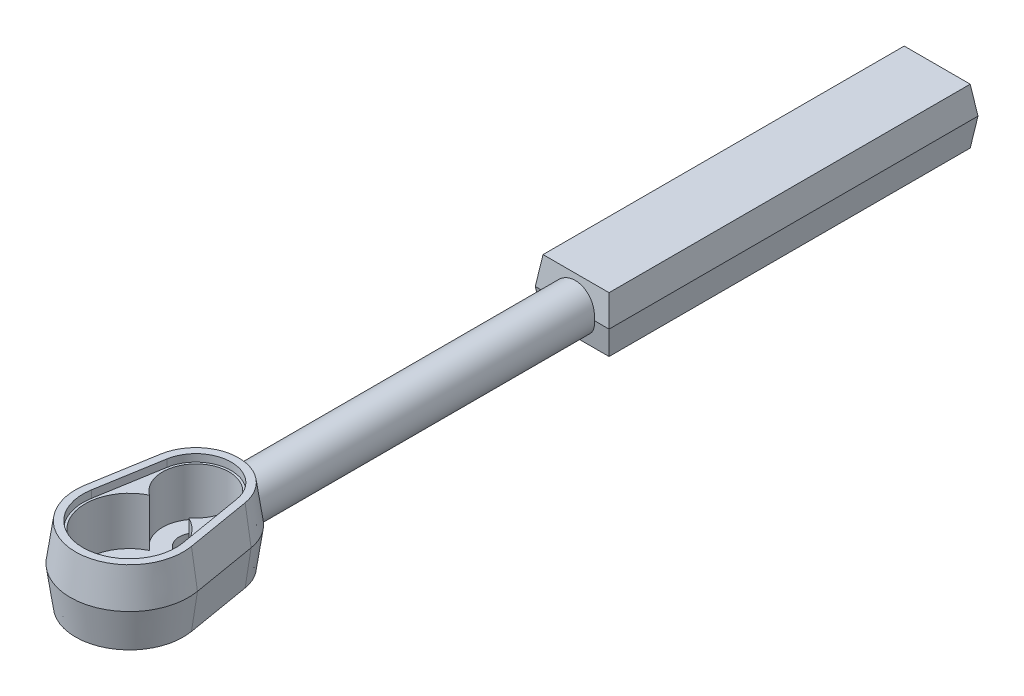
ISO-10303-21;
HEADER;
FILE_DESCRIPTION(('STEP AP214'),'2;1');
FILE_NAME('part.step','',(''),(''),'','','');
FILE_SCHEMA(('AUTOMOTIVE_DESIGN { 1 0 10303 214 1 1 1 1 }'));
ENDSEC;
DATA;
#1=APPLICATION_CONTEXT('core data for automotive mechanical design processes');
#2=APPLICATION_PROTOCOL_DEFINITION('international standard','automotive_design',2000,#1);
#3=PRODUCT_CONTEXT('',#1,'mechanical');
#4=PRODUCT('Part','Part','',(#3));
#5=PRODUCT_RELATED_PRODUCT_CATEGORY('part','',(#4));
#6=PRODUCT_DEFINITION_FORMATION('','',#4);
#7=PRODUCT_DEFINITION_CONTEXT('part definition',#1,'design');
#8=PRODUCT_DEFINITION('design','',#6,#7);
#9=PRODUCT_DEFINITION_SHAPE('','',#8);
#10=(LENGTH_UNIT() NAMED_UNIT(*) SI_UNIT(.MILLI.,.METRE.));
#11=(NAMED_UNIT(*) PLANE_ANGLE_UNIT() SI_UNIT($,.RADIAN.));
#12=(NAMED_UNIT(*) SI_UNIT($,.STERADIAN.) SOLID_ANGLE_UNIT());
#13=UNCERTAINTY_MEASURE_WITH_UNIT(LENGTH_MEASURE(1.E-05),#10,'distance_accuracy_value','');
#14=(GEOMETRIC_REPRESENTATION_CONTEXT(3) GLOBAL_UNCERTAINTY_ASSIGNED_CONTEXT((#13)) GLOBAL_UNIT_ASSIGNED_CONTEXT((#10,
#11,#12)) REPRESENTATION_CONTEXT('',''));
#15=CARTESIAN_POINT('',(0.,0.,0.));
#16=DIRECTION('',(0.,0.,1.));
#17=DIRECTION('',(1.,0.,0.));
#18=AXIS2_PLACEMENT_3D('',#15,#16,#17);
#19=CARTESIAN_POINT('',(-10.,0.,-220.));
#20=DIRECTION('',(-0.99026806874157,-0.139173100960066,0.));
#21=DIRECTION('',(0.139173100960066,-0.99026806874157,0.));
#22=AXIS2_PLACEMENT_3D('',#19,#20,#21);
#23=PLANE('',#22);
#24=DIRECTION('',(0.,0.,1.));
#25=VECTOR('',#24,1.);
#26=CARTESIAN_POINT('',(-10.,0.,-220.));
#27=LINE('',#26,#25);
#28=CARTESIAN_POINT('',(-10.,0.,-220.));
#29=VERTEX_POINT('',#28);
#30=CARTESIAN_POINT('',(-10.,0.,-120.));
#31=VERTEX_POINT('',#30);
#32=EDGE_CURVE('E339',#29,#31,#27,.T.);
#33=ORIENTED_EDGE('',*,*,#32,.F.);
#34=DIRECTION('',(-0.137844537491629,0.980814848463989,-0.137844537491629));
#35=VECTOR('',#34,1.);
#36=CARTESIAN_POINT('',(-10.,0.,-220.));
#37=LINE('',#36,#35);
#38=CARTESIAN_POINT('',(-8.94594373973206,-7.5,-218.945943739732));
#39=VERTEX_POINT('',#38);
#40=EDGE_CURVE('E381',#39,#29,#37,.T.);
#41=ORIENTED_EDGE('',*,*,#40,.F.);
#42=DIRECTION('',(0.,0.,1.));
#43=VECTOR('',#42,1.);
#44=CARTESIAN_POINT('',(-8.94594373973206,-7.5,-220.));
#45=LINE('',#44,#43);
#46=CARTESIAN_POINT('',(-8.94594373973208,-7.5,-121.054056260268));
#47=VERTEX_POINT('',#46);
#48=EDGE_CURVE('E380',#39,#47,#45,.T.);
#49=ORIENTED_EDGE('',*,*,#48,.T.);
#50=DIRECTION('',(-0.137844537491629,0.980814848463989,0.137844537491629));
#51=VECTOR('',#50,1.);
#52=CARTESIAN_POINT('',(-8.09988834837191,-13.5199969151441,-121.900111651628));
#53=LINE('',#52,#51);
#54=EDGE_CURVE('E386',#47,#31,#53,.T.);
#55=ORIENTED_EDGE('',*,*,#54,.T.);
#56=EDGE_LOOP('',(#33,#41,#49,#55));
#57=FACE_BOUND('',#56,.T.);
#58=ADVANCED_FACE('F41',(#57),#23,.T.);
#59=CARTESIAN_POINT('',(-10.,0.,-220.));
#60=DIRECTION('',(0.,-0.139173100960066,-0.99026806874157));
#61=DIRECTION('',(0.,0.99026806874157,-0.139173100960066));
#62=AXIS2_PLACEMENT_3D('',#59,#60,#61);
#63=PLANE('',#62);
#64=DIRECTION('',(-1.,0.,0.));
#65=VECTOR('',#64,1.);
#66=CARTESIAN_POINT('',(-10.,0.,-220.));
#67=LINE('',#66,#65);
#68=CARTESIAN_POINT('',(10.,0.,-220.));
#69=VERTEX_POINT('',#68);
#70=EDGE_CURVE('E376',#69,#29,#67,.T.);
#71=ORIENTED_EDGE('',*,*,#70,.F.);
#72=DIRECTION('',(0.137844537491629,0.980814848463989,-0.137844537491629));
#73=VECTOR('',#72,1.);
#74=CARTESIAN_POINT('',(10.,0.,-220.));
#75=LINE('',#74,#73);
#76=CARTESIAN_POINT('',(8.94594373973206,-7.5,-218.945943739732));
#77=VERTEX_POINT('',#76);
#78=EDGE_CURVE('E385',#77,#69,#75,.T.);
#79=ORIENTED_EDGE('',*,*,#78,.F.);
#80=DIRECTION('',(-1.,0.,0.));
#81=VECTOR('',#80,1.);
#82=CARTESIAN_POINT('',(-10.,-7.5,-218.945943739732));
#83=LINE('',#82,#81);
#84=EDGE_CURVE('E390',#77,#39,#83,.T.);
#85=ORIENTED_EDGE('',*,*,#84,.T.);
#86=ORIENTED_EDGE('',*,*,#40,.T.);
#87=EDGE_LOOP('',(#71,#79,#85,#86));
#88=FACE_BOUND('',#87,.T.);
#89=ADVANCED_FACE('F43',(#88),#63,.T.);
#90=CARTESIAN_POINT('',(10.,0.,-220.));
#91=DIRECTION('',(0.99026806874157,-0.139173100960066,0.));
#92=DIRECTION('',(0.139173100960066,0.99026806874157,0.));
#93=AXIS2_PLACEMENT_3D('',#90,#91,#92);
#94=PLANE('',#93);
#95=DIRECTION('',(0.,0.,-1.));
#96=VECTOR('',#95,1.);
#97=CARTESIAN_POINT('',(10.,0.,-220.));
#98=LINE('',#97,#96);
#99=CARTESIAN_POINT('',(10.,0.,-120.));
#100=VERTEX_POINT('',#99);
#101=EDGE_CURVE('E372',#100,#69,#98,.T.);
#102=ORIENTED_EDGE('',*,*,#101,.F.);
#103=DIRECTION('',(0.137844537491629,0.980814848463989,0.137844537491629));
#104=VECTOR('',#103,1.);
#105=CARTESIAN_POINT('',(10.,0.,-120.));
#106=LINE('',#105,#104);
#107=CARTESIAN_POINT('',(8.94594373973208,-7.5,-121.054056260268));
#108=VERTEX_POINT('',#107);
#109=EDGE_CURVE('E389',#108,#100,#106,.T.);
#110=ORIENTED_EDGE('',*,*,#109,.F.);
#111=DIRECTION('',(0.,0.,-1.));
#112=VECTOR('',#111,1.);
#113=CARTESIAN_POINT('',(8.94594373973206,-7.5,-220.));
#114=LINE('',#113,#112);
#115=EDGE_CURVE('E403',#108,#77,#114,.T.);
#116=ORIENTED_EDGE('',*,*,#115,.T.);
#117=ORIENTED_EDGE('',*,*,#78,.T.);
#118=EDGE_LOOP('',(#102,#110,#116,#117));
#119=FACE_BOUND('',#118,.T.);
#120=ADVANCED_FACE('F467',(#119),#94,.T.);
#121=CARTESIAN_POINT('',(10.,0.,-120.));
#122=DIRECTION('',(0.,-0.139173100960066,0.99026806874157));
#123=DIRECTION('',(0.,-0.99026806874157,-0.139173100960066));
#124=AXIS2_PLACEMENT_3D('',#121,#122,#123);
#125=PLANE('',#124);
#126=CARTESIAN_POINT('',(0.,0.,-120.));
#127=DIRECTION('',(0.,-0.139173100960066,0.99026806874157));
#128=DIRECTION('',(0.,0.99026806874157,0.139173100960066));
#129=AXIS2_PLACEMENT_3D('',#126,#127,#128);
#130=ELLIPSE('',#129,6.05896543511171,6.);
#131=CARTESIAN_POINT('',(6.,0.,-120.));
#132=VERTEX_POINT('',#131);
#133=CARTESIAN_POINT('',(-6.,0.,-120.));
#134=VERTEX_POINT('',#133);
#135=EDGE_CURVE('E328',#132,#134,#130,.F.);
#136=ORIENTED_EDGE('',*,*,#135,.T.);
#137=DIRECTION('',(1.,0.,0.));
#138=VECTOR('',#137,1.);
#139=CARTESIAN_POINT('',(10.,0.,-120.));
#140=LINE('',#139,#138);
#141=EDGE_CURVE('E368',#31,#134,#140,.T.);
#142=ORIENTED_EDGE('',*,*,#141,.F.);
#143=ORIENTED_EDGE('',*,*,#54,.F.);
#144=DIRECTION('',(1.,0.,0.));
#145=VECTOR('',#144,1.);
#146=CARTESIAN_POINT('',(10.,-7.5,-121.054056260268));
#147=LINE('',#146,#145);
#148=EDGE_CURVE('E399',#47,#108,#147,.T.);
#149=ORIENTED_EDGE('',*,*,#148,.T.);
#150=ORIENTED_EDGE('',*,*,#109,.T.);
#151=EDGE_CURVE('E367',#132,#100,#140,.T.);
#152=ORIENTED_EDGE('',*,*,#151,.F.);
#153=EDGE_LOOP('',(#136,#142,#143,#149,#150,#152));
#154=FACE_BOUND('',#153,.T.);
#155=ADVANCED_FACE('F473',(#154),#125,.T.);
#156=CARTESIAN_POINT('',(0.,-7.5,0.));
#157=DIRECTION('',(0.,-1.,0.));
#158=DIRECTION('',(0.,0.,-1.));
#159=AXIS2_PLACEMENT_3D('',#156,#157,#158);
#160=PLANE('',#159);
#161=ORIENTED_EDGE('',*,*,#48,.F.);
#162=ORIENTED_EDGE('',*,*,#84,.F.);
#163=ORIENTED_EDGE('',*,*,#115,.F.);
#164=ORIENTED_EDGE('',*,*,#148,.F.);
#165=EDGE_LOOP('',(#161,#162,#163,#164));
#166=FACE_BOUND('',#165,.T.);
#167=ADVANCED_FACE('F471',(#166),#160,.T.);
#168=CARTESIAN_POINT('',(-10.,0.,-220.));
#169=DIRECTION('',(-0.99026806874157,0.139173100960066,0.));
#170=DIRECTION('',(-0.139173100960066,-0.99026806874157,0.));
#171=AXIS2_PLACEMENT_3D('',#168,#169,#170);
#172=PLANE('',#171);
#173=ORIENTED_EDGE('',*,*,#32,.T.);
#174=DIRECTION('',(-0.137844537491629,-0.980814848463989,0.137844537491629));
#175=VECTOR('',#174,1.);
#176=CARTESIAN_POINT('',(-9.61997766967439,2.70399938302882,-120.380022330326));
#177=LINE('',#176,#175);
#178=CARTESIAN_POINT('',(-8.94594373973208,7.5,-121.054056260268));
#179=VERTEX_POINT('',#178);
#180=EDGE_CURVE('E335',#179,#31,#177,.T.);
#181=ORIENTED_EDGE('',*,*,#180,.F.);
#182=DIRECTION('',(0.,0.,-1.));
#183=VECTOR('',#182,1.);
#184=CARTESIAN_POINT('',(-8.94594373973209,7.5,0.));
#185=LINE('',#184,#183);
#186=CARTESIAN_POINT('',(-8.94594373973206,7.5,-218.945943739732));
#187=VERTEX_POINT('',#186);
#188=EDGE_CURVE('E332',#187,#179,#185,.F.);
#189=ORIENTED_EDGE('',*,*,#188,.F.);
#190=DIRECTION('',(-0.137844537491629,-0.980814848463989,-0.137844537491629));
#191=VECTOR('',#190,1.);
#192=CARTESIAN_POINT('',(-10.,0.,-220.));
#193=LINE('',#192,#191);
#194=EDGE_CURVE('E341',#187,#29,#193,.T.);
#195=ORIENTED_EDGE('',*,*,#194,.T.);
#196=EDGE_LOOP('',(#173,#181,#189,#195));
#197=FACE_BOUND('',#196,.T.);
#198=ADVANCED_FACE('F504',(#197),#172,.T.);
#199=CARTESIAN_POINT('',(10.,0.,-120.));
#200=DIRECTION('',(0.,0.139173100960066,0.99026806874157));
#201=DIRECTION('',(0.,-0.99026806874157,0.139173100960066));
#202=AXIS2_PLACEMENT_3D('',#199,#200,#201);
#203=PLANE('',#202);
#204=ORIENTED_EDGE('',*,*,#141,.T.);
#205=CARTESIAN_POINT('',(0.,0.,-120.));
#206=DIRECTION('',(0.,0.139173100960066,0.99026806874157));
#207=DIRECTION('',(0.,-0.99026806874157,0.139173100960066));
#208=AXIS2_PLACEMENT_3D('',#205,#206,#207);
#209=ELLIPSE('',#208,6.05896543511171,6.);
#210=EDGE_CURVE('E302',#132,#134,#209,.T.);
#211=ORIENTED_EDGE('',*,*,#210,.F.);
#212=ORIENTED_EDGE('',*,*,#151,.T.);
#213=DIRECTION('',(0.137844537491629,-0.980814848463989,0.137844537491629));
#214=VECTOR('',#213,1.);
#215=CARTESIAN_POINT('',(8.09988834837191,13.5199969151441,-121.900111651628));
#216=LINE('',#215,#214);
#217=CARTESIAN_POINT('',(8.94594373973208,7.5,-121.054056260268));
#218=VERTEX_POINT('',#217);
#219=EDGE_CURVE('E340',#218,#100,#216,.T.);
#220=ORIENTED_EDGE('',*,*,#219,.F.);
#221=DIRECTION('',(-1.,0.,0.));
#222=VECTOR('',#221,1.);
#223=CARTESIAN_POINT('',(0.,7.5,-121.054056260268));
#224=LINE('',#223,#222);
#225=EDGE_CURVE('E356',#179,#218,#224,.F.);
#226=ORIENTED_EDGE('',*,*,#225,.F.);
#227=ORIENTED_EDGE('',*,*,#180,.T.);
#228=EDGE_LOOP('',(#204,#211,#212,#220,#226,#227));
#229=FACE_BOUND('',#228,.T.);
#230=ADVANCED_FACE('F489',(#229),#203,.T.);
#231=CARTESIAN_POINT('',(10.,0.,-220.));
#232=DIRECTION('',(0.99026806874157,0.139173100960066,0.));
#233=DIRECTION('',(-0.139173100960066,0.99026806874157,0.));
#234=AXIS2_PLACEMENT_3D('',#231,#232,#233);
#235=PLANE('',#234);
#236=ORIENTED_EDGE('',*,*,#101,.T.);
#237=DIRECTION('',(0.137844537491629,-0.980814848463989,-0.137844537491629));
#238=VECTOR('',#237,1.);
#239=CARTESIAN_POINT('',(9.61997766967438,2.70399938302881,-219.619977669674));
#240=LINE('',#239,#238);
#241=CARTESIAN_POINT('',(8.94594373973206,7.5,-218.945943739732));
#242=VERTEX_POINT('',#241);
#243=EDGE_CURVE('E345',#242,#69,#240,.T.);
#244=ORIENTED_EDGE('',*,*,#243,.F.);
#245=DIRECTION('',(0.,0.,1.));
#246=VECTOR('',#245,1.);
#247=CARTESIAN_POINT('',(8.94594373973209,7.5,0.));
#248=LINE('',#247,#246);
#249=EDGE_CURVE('E359',#218,#242,#248,.F.);
#250=ORIENTED_EDGE('',*,*,#249,.F.);
#251=ORIENTED_EDGE('',*,*,#219,.T.);
#252=EDGE_LOOP('',(#236,#244,#250,#251));
#253=FACE_BOUND('',#252,.T.);
#254=ADVANCED_FACE('F487',(#253),#235,.T.);
#255=CARTESIAN_POINT('',(-10.,0.,-220.));
#256=DIRECTION('',(0.,0.139173100960066,-0.99026806874157));
#257=DIRECTION('',(0.,0.99026806874157,0.139173100960066));
#258=AXIS2_PLACEMENT_3D('',#255,#256,#257);
#259=PLANE('',#258);
#260=ORIENTED_EDGE('',*,*,#70,.T.);
#261=ORIENTED_EDGE('',*,*,#194,.F.);
#262=DIRECTION('',(1.,0.,0.));
#263=VECTOR('',#262,1.);
#264=CARTESIAN_POINT('',(0.,7.5,-218.945943739732));
#265=LINE('',#264,#263);
#266=EDGE_CURVE('E346',#242,#187,#265,.F.);
#267=ORIENTED_EDGE('',*,*,#266,.F.);
#268=ORIENTED_EDGE('',*,*,#243,.T.);
#269=EDGE_LOOP('',(#260,#261,#267,#268));
#270=FACE_BOUND('',#269,.T.);
#271=ADVANCED_FACE('F500',(#270),#259,.T.);
#272=CARTESIAN_POINT('',(0.,7.5,0.));
#273=DIRECTION('',(0.,-1.,0.));
#274=DIRECTION('',(0.,0.,-1.));
#275=AXIS2_PLACEMENT_3D('',#272,#273,#274);
#276=PLANE('',#275);
#277=ORIENTED_EDGE('',*,*,#188,.T.);
#278=ORIENTED_EDGE('',*,*,#225,.T.);
#279=ORIENTED_EDGE('',*,*,#249,.T.);
#280=ORIENTED_EDGE('',*,*,#266,.T.);
#281=EDGE_LOOP('',(#277,#278,#279,#280));
#282=FACE_BOUND('',#281,.T.);
#283=ADVANCED_FACE('F507',(#282),#276,.F.);
#284=CARTESIAN_POINT('',(0.,0.,-220.002));
#285=DIRECTION('',(0.,0.,1.));
#286=DIRECTION('',(1.,0.,0.));
#287=AXIS2_PLACEMENT_3D('',#284,#285,#286);
#288=CYLINDRICAL_SURFACE('',#287,6.);
#289=CARTESIAN_POINT('',(-5.99999999666667,0.000199999999995375,-29.5325942811291));
#290=CARTESIAN_POINT('',(-6.00002992792909,-0.151218651093155,-29.5085661474931));
#291=CARTESIAN_POINT('',(-5.99427894788047,-0.303119796093207,-29.4875005480691));
#292=CARTESIAN_POINT('',(-5.9711770336946,-0.606750063586477,-29.4514352085594));
#293=CARTESIAN_POINT('',(-5.9538267217443,-0.758479194869238,-29.4364351431884));
#294=CARTESIAN_POINT('',(-5.90757552222113,-1.06007434917652,-29.4126839878457));
#295=CARTESIAN_POINT('',(-5.87871850254159,-1.20994524425704,-29.4039095127088));
#296=CARTESIAN_POINT('',(-5.80960049597579,-1.50725901553476,-29.3923920714734));
#297=CARTESIAN_POINT('',(-5.76934004533608,-1.65470200555934,-29.3896488218096));
#298=CARTESIAN_POINT('',(-5.67767593200179,-1.94610696136278,-29.3898763346895));
#299=CARTESIAN_POINT('',(-5.62626995680582,-2.0900681978382,-29.3928482840457));
#300=CARTESIAN_POINT('',(-5.51268682835494,-2.37352248064231,-29.4040088799536));
#301=CARTESIAN_POINT('',(-5.45050552563165,-2.51301378103341,-29.4121995394419));
#302=CARTESIAN_POINT('',(-5.3158371198766,-2.78659620822429,-29.43315899522));
#303=CARTESIAN_POINT('',(-5.24334860011664,-2.92068658941032,-29.4459284212297));
#304=CARTESIAN_POINT('',(-5.08858633853765,-3.1826830083291,-29.475300083296));
#305=CARTESIAN_POINT('',(-5.00630870493085,-3.31058655779247,-29.4919038462275));
#306=CARTESIAN_POINT('',(-4.74043734617398,-3.69131660243471,-29.5473452543197));
#307=CARTESIAN_POINT('',(-4.54176325327187,-3.93311404615501,-29.5911183109993));
#308=CARTESIAN_POINT('',(-4.10989474743587,-4.38246253767334,-29.6842627230525));
#309=CARTESIAN_POINT('',(-3.87668299778197,-4.58999627497704,-29.7336368870605));
#310=CARTESIAN_POINT('',(-3.49449531720796,-4.88026933114869,-29.8086733379768));
#311=CARTESIAN_POINT('',(-3.35579594362834,-4.9766630971621,-29.8348491937562));
#312=CARTESIAN_POINT('',(-3.07059682391096,-5.15751057488665,-29.8857792899281));
#313=CARTESIAN_POINT('',(-2.92409977767742,-5.24196838281464,-29.9105340162877));
#314=CARTESIAN_POINT('',(-2.62415860211827,-5.39837131843423,-29.9576904920033));
#315=CARTESIAN_POINT('',(-2.47071247791249,-5.47031282398957,-29.9800915594855));
#316=CARTESIAN_POINT('',(-2.15797225222118,-5.60105916319629,-30.0216875051223));
#317=CARTESIAN_POINT('',(-1.9986807098751,-5.65986966759437,-30.0408837663956));
#318=CARTESIAN_POINT('',(-1.67612425010615,-5.76360656644561,-30.0752758094772));
#319=CARTESIAN_POINT('',(-1.51288388479909,-5.80860258334658,-30.0904915927139));
#320=CARTESIAN_POINT('',(-1.1828408601527,-5.8846890019793,-30.1164860029089));
#321=CARTESIAN_POINT('',(-1.01603819179191,-5.91577936849089,-30.1272646186288));
#322=CARTESIAN_POINT('',(-0.68020581333457,-5.96373056583845,-30.1439786488302));
#323=CARTESIAN_POINT('',(-0.511176752254169,-5.98059545422229,-30.1499154443331));
#324=CARTESIAN_POINT('',(-0.172198805124783,-5.99993032087823,-30.1567268887685));
#325=CARTESIAN_POINT('',(-0.0022499600538685,-6.00240093524283,-30.1576017613906));
#326=CARTESIAN_POINT('',(0.328208538482514,-5.99317454810193,-30.1543466650239));
#327=CARTESIAN_POINT('',(0.48874208322506,-5.98221986419952,-30.1504789207207));
#328=CARTESIAN_POINT('',(0.808301846250918,-5.94747740972475,-30.1383044367028));
#329=CARTESIAN_POINT('',(0.96732751349059,-5.9236851187202,-30.1299961333697));
#330=CARTESIAN_POINT('',(1.28262937381519,-5.86349834509096,-30.1092233664525));
#331=CARTESIAN_POINT('',(1.43890663239342,-5.82710886455174,-30.096760552612));
#332=CARTESIAN_POINT('',(1.74778425250741,-5.74203117300845,-30.0680892907115));
#333=CARTESIAN_POINT('',(1.90038319558805,-5.6933382980484,-30.0518794224215));
#334=CARTESIAN_POINT('',(2.20121218808095,-5.58393599349999,-30.0162149530037));
#335=CARTESIAN_POINT('',(2.34943152076215,-5.52319950691461,-29.9967530617069));
#336=CARTESIAN_POINT('',(2.64029427127236,-5.39021593117329,-29.9552517063129));
#337=CARTESIAN_POINT('',(2.78293578500048,-5.31796495330368,-29.9332113720863));
#338=CARTESIAN_POINT('',(3.06181057164482,-5.16244248288279,-29.8872910960986));
#339=CARTESIAN_POINT('',(3.19804230175557,-5.07916835531729,-29.8634107150583));
#340=CARTESIAN_POINT('',(3.46331767784015,-4.90212831507771,-29.8146281921041));
#341=CARTESIAN_POINT('',(3.59236105057956,-4.80836200399554,-29.7897260114133));
#342=CARTESIAN_POINT('',(3.84936650269237,-4.6054983063354,-29.7384166854213));
#343=CARTESIAN_POINT('',(3.97688832095483,-4.49584454928381,-29.7120013289689));
#344=CARTESIAN_POINT('',(4.22233880693735,-4.26615719162508,-29.6601033550278));
#345=CARTESIAN_POINT('',(4.3402706158378,-4.14612701657716,-29.6346204336391));
#346=CARTESIAN_POINT('',(4.56587047539392,-3.8963011531788,-29.5856971317631));
#347=CARTESIAN_POINT('',(4.67353462369759,-3.76650178519395,-29.5622575281527));
#348=CARTESIAN_POINT('',(4.87774309535473,-3.4980074164215,-29.5185900281788));
#349=CARTESIAN_POINT('',(4.97429230538688,-3.35931636693623,-29.4983607189187));
#350=CARTESIAN_POINT('',(5.15589211933968,-3.07336300063602,-29.4621676479762));
#351=CARTESIAN_POINT('',(5.2409010243457,-2.92607221422501,-29.4462191616379));
#352=CARTESIAN_POINT('',(5.39824297224057,-2.62447866168839,-29.4197605372729));
#353=CARTESIAN_POINT('',(5.47058191082923,-2.47017919922155,-29.4092478653358));
#354=CARTESIAN_POINT('',(5.60191235438314,-2.15582023674197,-29.3945934859537));
#355=CARTESIAN_POINT('',(5.66091352845305,-1.99576500752462,-29.3904471505723));
#356=CARTESIAN_POINT('',(5.76506147267256,-1.67126311610587,-29.3892281013767));
#357=CARTESIAN_POINT('',(5.81021272790047,-1.50681789432626,-29.3921530948929));
#358=CARTESIAN_POINT('',(5.89885253894104,-1.12013714400863,-29.407762025379));
#359=CARTESIAN_POINT('',(5.93688685144298,-0.896720493822514,-29.4233450387258));
#360=CARTESIAN_POINT('',(5.97482094345766,-0.560610748944884,-29.4568412973814));
#361=CARTESIAN_POINT('',(5.9842793776413,-0.448376060159941,-29.469699076336));
#362=CARTESIAN_POINT('',(5.9968713521142,-0.223953611118437,-29.4987028556576));
#363=CARTESIAN_POINT('',(6.00000366407086,-0.111765864203619,-29.5148494939471));
#364=CARTESIAN_POINT('',(5.99999999666667,0.000199999999995216,-29.5325942811291));
#365=B_SPLINE_CURVE_WITH_KNOTS('',3,(#289,#290,#291,#292,#293,#294,#295,#296,#297,#298,#299,
#300,#301,#302,#303,#304,#305,#306,#307,#308,#309,#310,#311,#312,#313,#314,#315,#316,#317,#318,
#319,#320,#321,#322,#323,#324,#325,#326,#327,#328,#329,#330,#331,#332,#333,#334,#335,#336,#337,
#338,#339,#340,#341,#342,#343,#344,#345,#346,#347,#348,#349,#350,#351,#352,#353,#354,#355,#356,
#357,#358,#359,#360,#361,#362,#363,#364),.UNSPECIFIED.,.F.,.F.,(4,2,2,2,2,2,2,2,2,2,2,2,2,2,2,2,
2,2,2,2,2,2,2,2,2,2,2,2,2,2,2,2,2,2,2,2,2,4),(0.,0.459820451022817,0.919616239303568,
1.37767562078831,1.83571346559762,2.29384643634825,2.75215622307114,3.21052906553238,
3.6690847527859,4.61287699028651,5.55714459506866,6.06939684738371,6.58147287435331,
7.09369684717331,7.60569918152931,8.11507707681797,8.62445626224922,9.13369010774962,
9.64290144969859,10.1251841344891,10.6076367536196,11.0898980200405,11.5723423764771,
12.055883122035,12.5395875180584,13.0234077500696,13.5072463598899,14.017391482263,
14.5273688292844,15.037539233485,15.5474844778734,16.0592258825975,16.5707285229884,
17.0818591559694,17.5928240921671,18.2722219080654,18.6121257886577,18.9520956614775),.UNSPECIFIED.);
#366=CARTESIAN_POINT('',(-6.,0.,-29.5325625946708));
#367=VERTEX_POINT('',#366);
#368=CARTESIAN_POINT('',(6.,0.,-29.5325625946708));
#369=VERTEX_POINT('',#368);
#370=EDGE_CURVE('E12',#367,#369,#365,.T.);
#371=ORIENTED_EDGE('',*,*,#370,.F.);
#372=CARTESIAN_POINT('',(-5.99999999666667,-0.000199999999995375,-29.5325942811291));
#373=CARTESIAN_POINT('',(-6.00002992792909,0.151218651093155,-29.5085661474931));
#374=CARTESIAN_POINT('',(-5.99427894788047,0.303119796093207,-29.4875005480691));
#375=CARTESIAN_POINT('',(-5.9711770336946,0.606750063586477,-29.4514352085594));
#376=CARTESIAN_POINT('',(-5.9538267217443,0.758479194869238,-29.4364351431884));
#377=CARTESIAN_POINT('',(-5.90757552222113,1.06007434917652,-29.4126839878457));
#378=CARTESIAN_POINT('',(-5.87871850254159,1.20994524425704,-29.4039095127088));
#379=CARTESIAN_POINT('',(-5.80960049597579,1.50725901553476,-29.3923920714734));
#380=CARTESIAN_POINT('',(-5.76934004533608,1.65470200555934,-29.3896488218096));
#381=CARTESIAN_POINT('',(-5.67767593200179,1.94610696136278,-29.3898763346895));
#382=CARTESIAN_POINT('',(-5.62626995680582,2.0900681978382,-29.3928482840457));
#383=CARTESIAN_POINT('',(-5.51268682835494,2.37352248064231,-29.4040088799536));
#384=CARTESIAN_POINT('',(-5.45050552563165,2.51301378103341,-29.4121995394419));
#385=CARTESIAN_POINT('',(-5.3158371198766,2.78659620822429,-29.43315899522));
#386=CARTESIAN_POINT('',(-5.24334860011664,2.92068658941032,-29.4459284212297));
#387=CARTESIAN_POINT('',(-5.08858633853765,3.1826830083291,-29.475300083296));
#388=CARTESIAN_POINT('',(-5.00630870493085,3.31058655779247,-29.4919038462275));
#389=CARTESIAN_POINT('',(-4.74043734617398,3.69131660243471,-29.5473452543197));
#390=CARTESIAN_POINT('',(-4.54176325327187,3.93311404615501,-29.5911183109993));
#391=CARTESIAN_POINT('',(-4.10989474743587,4.38246253767334,-29.6842627230525));
#392=CARTESIAN_POINT('',(-3.87668299778197,4.58999627497704,-29.7336368870605));
#393=CARTESIAN_POINT('',(-3.49449531720796,4.88026933114869,-29.8086733379768));
#394=CARTESIAN_POINT('',(-3.35579594362834,4.9766630971621,-29.8348491937562));
#395=CARTESIAN_POINT('',(-3.07059682391096,5.15751057488665,-29.8857792899281));
#396=CARTESIAN_POINT('',(-2.92409977767742,5.24196838281464,-29.9105340162877));
#397=CARTESIAN_POINT('',(-2.62415860211827,5.39837131843423,-29.9576904920033));
#398=CARTESIAN_POINT('',(-2.47071247791249,5.47031282398957,-29.9800915594855));
#399=CARTESIAN_POINT('',(-2.15797225222118,5.60105916319629,-30.0216875051223));
#400=CARTESIAN_POINT('',(-1.9986807098751,5.65986966759437,-30.0408837663956));
#401=CARTESIAN_POINT('',(-1.67612425010615,5.76360656644561,-30.0752758094772));
#402=CARTESIAN_POINT('',(-1.51288388479909,5.80860258334658,-30.0904915927139));
#403=CARTESIAN_POINT('',(-1.1828408601527,5.8846890019793,-30.1164860029089));
#404=CARTESIAN_POINT('',(-1.01603819179191,5.91577936849089,-30.1272646186288));
#405=CARTESIAN_POINT('',(-0.68020581333457,5.96373056583845,-30.1439786488302));
#406=CARTESIAN_POINT('',(-0.511176752254169,5.98059545422229,-30.1499154443331));
#407=CARTESIAN_POINT('',(-0.172198805124783,5.99993032087823,-30.1567268887685));
#408=CARTESIAN_POINT('',(-0.0022499600538685,6.00240093524283,-30.1576017613906));
#409=CARTESIAN_POINT('',(0.328208538482514,5.99317454810193,-30.1543466650239));
#410=CARTESIAN_POINT('',(0.48874208322506,5.98221986419952,-30.1504789207207));
#411=CARTESIAN_POINT('',(0.808301846250918,5.94747740972475,-30.1383044367028));
#412=CARTESIAN_POINT('',(0.96732751349059,5.9236851187202,-30.1299961333697));
#413=CARTESIAN_POINT('',(1.28262937381519,5.86349834509096,-30.1092233664525));
#414=CARTESIAN_POINT('',(1.43890663239342,5.82710886455174,-30.096760552612));
#415=CARTESIAN_POINT('',(1.74778425250741,5.74203117300845,-30.0680892907115));
#416=CARTESIAN_POINT('',(1.90038319558805,5.6933382980484,-30.0518794224215));
#417=CARTESIAN_POINT('',(2.20121218808095,5.58393599349999,-30.0162149530037));
#418=CARTESIAN_POINT('',(2.34943152076215,5.52319950691461,-29.9967530617069));
#419=CARTESIAN_POINT('',(2.64029427127236,5.39021593117329,-29.9552517063129));
#420=CARTESIAN_POINT('',(2.78293578500048,5.31796495330368,-29.9332113720863));
#421=CARTESIAN_POINT('',(3.06181057164482,5.16244248288279,-29.8872910960986));
#422=CARTESIAN_POINT('',(3.19804230175557,5.07916835531729,-29.8634107150583));
#423=CARTESIAN_POINT('',(3.46331767784015,4.90212831507771,-29.8146281921041));
#424=CARTESIAN_POINT('',(3.59236105057956,4.80836200399554,-29.7897260114133));
#425=CARTESIAN_POINT('',(3.84936650269237,4.6054983063354,-29.7384166854213));
#426=CARTESIAN_POINT('',(3.97688832095483,4.49584454928381,-29.7120013289689));
#427=CARTESIAN_POINT('',(4.22233880693735,4.26615719162508,-29.6601033550278));
#428=CARTESIAN_POINT('',(4.3402706158378,4.14612701657716,-29.6346204336391));
#429=CARTESIAN_POINT('',(4.56587047539392,3.8963011531788,-29.5856971317631));
#430=CARTESIAN_POINT('',(4.67353462369759,3.76650178519395,-29.5622575281527));
#431=CARTESIAN_POINT('',(4.87774309535473,3.4980074164215,-29.5185900281788));
#432=CARTESIAN_POINT('',(4.97429230538688,3.35931636693623,-29.4983607189187));
#433=CARTESIAN_POINT('',(5.15589211933968,3.07336300063602,-29.4621676479762));
#434=CARTESIAN_POINT('',(5.2409010243457,2.92607221422501,-29.4462191616379));
#435=CARTESIAN_POINT('',(5.39824297224057,2.62447866168839,-29.4197605372729));
#436=CARTESIAN_POINT('',(5.47058191082923,2.47017919922155,-29.4092478653358));
#437=CARTESIAN_POINT('',(5.60191235438314,2.15582023674197,-29.3945934859537));
#438=CARTESIAN_POINT('',(5.66091352845305,1.99576500752462,-29.3904471505723));
#439=CARTESIAN_POINT('',(5.76506147267256,1.67126311610587,-29.3892281013767));
#440=CARTESIAN_POINT('',(5.81021272790047,1.50681789432626,-29.3921530948929));
#441=CARTESIAN_POINT('',(5.89885253894104,1.12013714400863,-29.407762025379));
#442=CARTESIAN_POINT('',(5.93688685144298,0.896720493822514,-29.4233450387258));
#443=CARTESIAN_POINT('',(5.97482094345766,0.560610748944884,-29.4568412973814));
#444=CARTESIAN_POINT('',(5.9842793776413,0.448376060159941,-29.469699076336));
#445=CARTESIAN_POINT('',(5.9968713521142,0.223953611118437,-29.4987028556576));
#446=CARTESIAN_POINT('',(6.00000366407086,0.111765864203619,-29.5148494939471));
#447=CARTESIAN_POINT('',(5.99999999666667,-0.000199999999995216,-29.5325942811291));
#448=B_SPLINE_CURVE_WITH_KNOTS('',3,(#372,#373,#374,#375,#376,#377,#378,#379,#380,#381,#382,
#383,#384,#385,#386,#387,#388,#389,#390,#391,#392,#393,#394,#395,#396,#397,#398,#399,#400,#401,
#402,#403,#404,#405,#406,#407,#408,#409,#410,#411,#412,#413,#414,#415,#416,#417,#418,#419,#420,
#421,#422,#423,#424,#425,#426,#427,#428,#429,#430,#431,#432,#433,#434,#435,#436,#437,#438,#439,
#440,#441,#442,#443,#444,#445,#446,#447),.UNSPECIFIED.,.F.,.F.,(4,2,2,2,2,2,2,2,2,2,2,2,2,2,2,2,
2,2,2,2,2,2,2,2,2,2,2,2,2,2,2,2,2,2,2,2,2,4),(0.,0.459820451022817,0.919616239303568,
1.37767562078831,1.83571346559762,2.29384643634825,2.75215622307114,3.21052906553238,
3.6690847527859,4.61287699028651,5.55714459506866,6.06939684738371,6.58147287435331,
7.09369684717331,7.60569918152931,8.11507707681797,8.62445626224922,9.13369010774962,
9.64290144969859,10.1251841344891,10.6076367536196,11.0898980200405,11.5723423764771,
12.055883122035,12.5395875180584,13.0234077500696,13.5072463598899,14.017391482263,
14.5273688292844,15.037539233485,15.5474844778734,16.0592258825975,16.5707285229884,
17.0818591559694,17.5928240921671,18.2722219080654,18.6121257886577,18.9520956614775),.UNSPECIFIED.);
#449=EDGE_CURVE('E56',#367,#369,#448,.T.);
#450=ORIENTED_EDGE('',*,*,#449,.T.);
#451=EDGE_LOOP('',(#371,#450));
#452=FACE_BOUND('',#451,.T.);
#453=ORIENTED_EDGE('',*,*,#135,.F.);
#454=ORIENTED_EDGE('',*,*,#210,.T.);
#455=EDGE_LOOP('',(#453,#454));
#456=FACE_BOUND('',#455,.T.);
#457=ADVANCED_FACE('F416',(#452,#456),#288,.T.);
#458=CARTESIAN_POINT('',(0.,0.,-18.));
#459=DIRECTION('',(0.,1.,0.));
#460=DIRECTION('',(0.,0.,-1.));
#461=AXIS2_PLACEMENT_3D('',#458,#459,#460);
#462=CONICAL_SURFACE('',#461,13.,0.139626340159547);
#463=CARTESIAN_POINT('',(0.,0.,-18.));
#464=DIRECTION('',(0.,1.,0.));
#465=DIRECTION('',(0.,0.,-1.));
#466=AXIS2_PLACEMENT_3D('',#463,#464,#465);
#467=CIRCLE('',#466,13.);
#468=CARTESIAN_POINT('',(-12.8181728633825,0.,-20.1666666666667));
#469=VERTEX_POINT('',#468);
#470=EDGE_CURVE('E257',#367,#469,#467,.T.);
#471=ORIENTED_EDGE('',*,*,#470,.F.);
#472=ORIENTED_EDGE('',*,*,#370,.T.);
#473=CARTESIAN_POINT('',(12.8181728633825,0.,-20.1666666666667));
#474=VERTEX_POINT('',#473);
#475=EDGE_CURVE('E282',#474,#369,#467,.T.);
#476=ORIENTED_EDGE('',*,*,#475,.F.);
#477=DIRECTION('',(0.137226528156854,0.99026806874157,-0.0231955168266776));
#478=VECTOR('',#477,1.);
#479=CARTESIAN_POINT('',(12.8181728633825,0.,-20.1666666666667));
#480=LINE('',#479,#478);
#481=CARTESIAN_POINT('',(11.4324215452446,-10.,-19.9324319421627));
#482=VERTEX_POINT('',#481);
#483=EDGE_CURVE('E298',#482,#474,#480,.T.);
#484=ORIENTED_EDGE('',*,*,#483,.F.);
#485=CARTESIAN_POINT('',(0.,-10.,-18.));
#486=DIRECTION('',(0.,-1.,0.));
#487=DIRECTION('',(0.,0.,-1.));
#488=AXIS2_PLACEMENT_3D('',#485,#486,#487);
#489=CIRCLE('',#488,11.5945916529761);
#490=CARTESIAN_POINT('',(-11.4324215452446,-10.,-19.9324319421627));
#491=VERTEX_POINT('',#490);
#492=EDGE_CURVE('E297',#482,#491,#489,.F.);
#493=ORIENTED_EDGE('',*,*,#492,.T.);
#494=DIRECTION('',(-0.137226528156854,0.99026806874157,-0.0231955168266776));
#495=VECTOR('',#494,1.);
#496=CARTESIAN_POINT('',(-12.8181728633825,0.,-20.1666666666667));
#497=LINE('',#496,#495);
#498=EDGE_CURVE('E304',#491,#469,#497,.T.);
#499=ORIENTED_EDGE('',*,*,#498,.T.);
#500=EDGE_LOOP('',(#471,#472,#476,#484,#493,#499));
#501=FACE_BOUND('',#500,.T.);
#502=ADVANCED_FACE('F444',(#501),#462,.T.);
#503=CARTESIAN_POINT('',(12.8181728633825,0.,-20.1666666666667));
#504=DIRECTION('',(0.976417483555184,-0.139173100960066,-0.165044678123595));
#505=DIRECTION('',(-0.166666666666667,0.,-0.986013297183269));
#506=AXIS2_PLACEMENT_3D('',#503,#504,#505);
#507=PLANE('',#506);
#508=DIRECTION('',(-0.166666666666667,0.,-0.986013297183269));
#509=VECTOR('',#508,1.);
#510=CARTESIAN_POINT('',(12.8181728633825,0.,-20.1666666666667));
#511=LINE('',#510,#509);
#512=CARTESIAN_POINT('',(15.7762127549323,0.,-2.66666666666667));
#513=VERTEX_POINT('',#512);
#514=EDGE_CURVE('E293',#513,#474,#511,.T.);
#515=ORIENTED_EDGE('',*,*,#514,.F.);
#516=DIRECTION('',(0.137226528156854,0.99026806874157,-0.0231955168266776));
#517=VECTOR('',#516,1.);
#518=CARTESIAN_POINT('',(15.7762127549323,0.,-2.66666666666667));
#519=LINE('',#518,#517);
#520=CARTESIAN_POINT('',(14.3904614367944,-10.,-2.43243194216268));
#521=VERTEX_POINT('',#520);
#522=EDGE_CURVE('E303',#521,#513,#519,.T.);
#523=ORIENTED_EDGE('',*,*,#522,.F.);
#524=DIRECTION('',(-0.166666666666667,0.,-0.986013297183269));
#525=VECTOR('',#524,1.);
#526=CARTESIAN_POINT('',(11.4324215452446,-10.,-19.9324319421627));
#527=LINE('',#526,#525);
#528=EDGE_CURVE('E309',#521,#482,#527,.T.);
#529=ORIENTED_EDGE('',*,*,#528,.T.);
#530=ORIENTED_EDGE('',*,*,#483,.T.);
#531=EDGE_LOOP('',(#515,#523,#529,#530));
#532=FACE_BOUND('',#531,.T.);
#533=ADVANCED_FACE('F448',(#532),#507,.T.);
#534=CARTESIAN_POINT('',(0.,0.,0.));
#535=DIRECTION('',(0.,1.,0.));
#536=DIRECTION('',(0.,0.,-1.));
#537=AXIS2_PLACEMENT_3D('',#534,#535,#536);
#538=CONICAL_SURFACE('',#537,16.,0.139626340159547);
#539=CARTESIAN_POINT('',(0.,0.,0.));
#540=DIRECTION('',(0.,1.,0.));
#541=DIRECTION('',(0.,0.,-1.));
#542=AXIS2_PLACEMENT_3D('',#539,#540,#541);
#543=CIRCLE('',#542,16.);
#544=CARTESIAN_POINT('',(-15.7762127549323,0.,-2.66666666666666));
#545=VERTEX_POINT('',#544);
#546=EDGE_CURVE('E289',#545,#513,#543,.T.);
#547=ORIENTED_EDGE('',*,*,#546,.F.);
#548=DIRECTION('',(-0.137226528156854,0.99026806874157,-0.0231955168266776));
#549=VECTOR('',#548,1.);
#550=CARTESIAN_POINT('',(-15.7762127549323,0.,-2.66666666666666));
#551=LINE('',#550,#549);
#552=CARTESIAN_POINT('',(-14.3904614367944,-10.,-2.43243194216267));
#553=VERTEX_POINT('',#552);
#554=EDGE_CURVE('E308',#553,#545,#551,.T.);
#555=ORIENTED_EDGE('',*,*,#554,.F.);
#556=CARTESIAN_POINT('',(0.,-10.,0.));
#557=DIRECTION('',(0.,-1.,0.));
#558=DIRECTION('',(0.,0.,-1.));
#559=AXIS2_PLACEMENT_3D('',#556,#557,#558);
#560=CIRCLE('',#559,14.5945916529761);
#561=EDGE_CURVE('E321',#553,#521,#560,.F.);
#562=ORIENTED_EDGE('',*,*,#561,.T.);
#563=ORIENTED_EDGE('',*,*,#522,.T.);
#564=EDGE_LOOP('',(#547,#555,#562,#563));
#565=FACE_BOUND('',#564,.T.);
#566=ADVANCED_FACE('F452',(#565),#538,.T.);
#567=CARTESIAN_POINT('',(-15.7762127549323,0.,-2.66666666666667));
#568=DIRECTION('',(-0.976417483555184,-0.139173100960066,-0.165044678123595));
#569=DIRECTION('',(-0.166666666666667,0.,0.986013297183269));
#570=AXIS2_PLACEMENT_3D('',#567,#568,#569);
#571=PLANE('',#570);
#572=DIRECTION('',(-0.166666666666667,0.,0.986013297183269));
#573=VECTOR('',#572,1.);
#574=CARTESIAN_POINT('',(-15.7762127549323,0.,-2.66666666666667));
#575=LINE('',#574,#573);
#576=EDGE_CURVE('E285',#469,#545,#575,.T.);
#577=ORIENTED_EDGE('',*,*,#576,.F.);
#578=ORIENTED_EDGE('',*,*,#498,.F.);
#579=DIRECTION('',(-0.166666666666667,0.,0.986013297183269));
#580=VECTOR('',#579,1.);
#581=CARTESIAN_POINT('',(-14.3904614367944,-10.,-2.43243194216268));
#582=LINE('',#581,#580);
#583=EDGE_CURVE('E317',#491,#553,#582,.T.);
#584=ORIENTED_EDGE('',*,*,#583,.T.);
#585=ORIENTED_EDGE('',*,*,#554,.T.);
#586=EDGE_LOOP('',(#577,#578,#584,#585));
#587=FACE_BOUND('',#586,.T.);
#588=ADVANCED_FACE('F442',(#587),#571,.T.);
#589=CARTESIAN_POINT('',(0.,-10.,-18.));
#590=DIRECTION('',(0.,-1.,0.));
#591=DIRECTION('',(0.,0.,-1.));
#592=AXIS2_PLACEMENT_3D('',#589,#590,#591);
#593=PLANE('',#592);
#594=CARTESIAN_POINT('',(0.,-10.,0.));
#595=DIRECTION('',(0.,1.,0.));
#596=DIRECTION('',(0.,0.,1.));
#597=AXIS2_PLACEMENT_3D('',#594,#595,#596);
#598=CIRCLE('',#597,6.);
#599=CARTESIAN_POINT('',(0.,-10.,6.));
#600=VERTEX_POINT('',#599);
#601=EDGE_CURVE('E747',#600,#600,#598,.T.);
#602=ORIENTED_EDGE('',*,*,#601,.T.);
#603=EDGE_LOOP('',(#602));
#604=FACE_BOUND('',#603,.T.);
#605=CARTESIAN_POINT('',(0.,-10.,-18.));
#606=DIRECTION('',(0.,1.,0.));
#607=DIRECTION('',(0.,0.,1.));
#608=AXIS2_PLACEMENT_3D('',#605,#606,#607);
#609=CIRCLE('',#608,4.5);
#610=CARTESIAN_POINT('',(0.,-10.,-13.5));
#611=VERTEX_POINT('',#610);
#612=EDGE_CURVE('E757',#611,#611,#609,.T.);
#613=ORIENTED_EDGE('',*,*,#612,.T.);
#614=EDGE_LOOP('',(#613));
#615=FACE_BOUND('',#614,.T.);
#616=ORIENTED_EDGE('',*,*,#492,.F.);
#617=ORIENTED_EDGE('',*,*,#528,.F.);
#618=ORIENTED_EDGE('',*,*,#561,.F.);
#619=ORIENTED_EDGE('',*,*,#583,.F.);
#620=EDGE_LOOP('',(#616,#617,#618,#619));
#621=FACE_BOUND('',#620,.T.);
#622=ADVANCED_FACE('F426',(#604,#615,#621),#593,.T.);
#623=CARTESIAN_POINT('',(0.,0.,-18.));
#624=DIRECTION('',(0.,-1.,0.));
#625=DIRECTION('',(0.,0.,-1.));
#626=AXIS2_PLACEMENT_3D('',#623,#624,#625);
#627=CONICAL_SURFACE('',#626,13.,0.139626340159547);
#628=ORIENTED_EDGE('',*,*,#449,.F.);
#629=ORIENTED_EDGE('',*,*,#470,.T.);
#630=DIRECTION('',(-0.137226528156854,-0.99026806874157,-0.0231955168266776));
#631=VECTOR('',#630,1.);
#632=CARTESIAN_POINT('',(-12.8181728633825,0.,-20.1666666666667));
#633=LINE('',#632,#631);
#634=CARTESIAN_POINT('',(-11.4324215452446,10.,-19.9324319421627));
#635=VERTEX_POINT('',#634);
#636=EDGE_CURVE('E253',#635,#469,#633,.T.);
#637=ORIENTED_EDGE('',*,*,#636,.F.);
#638=CARTESIAN_POINT('',(0.,10.,-18.));
#639=DIRECTION('',(0.,-1.,0.));
#640=DIRECTION('',(0.,0.,-1.));
#641=AXIS2_PLACEMENT_3D('',#638,#639,#640);
#642=CIRCLE('',#641,11.5945916529761);
#643=CARTESIAN_POINT('',(11.4324215452446,10.,-19.9324319421627));
#644=VERTEX_POINT('',#643);
#645=EDGE_CURVE('E244',#644,#635,#642,.F.);
#646=ORIENTED_EDGE('',*,*,#645,.F.);
#647=DIRECTION('',(0.137226528156854,-0.99026806874157,-0.0231955168266776));
#648=VECTOR('',#647,1.);
#649=CARTESIAN_POINT('',(12.8181728633825,0.,-20.1666666666667));
#650=LINE('',#649,#648);
#651=EDGE_CURVE('E259',#644,#474,#650,.T.);
#652=ORIENTED_EDGE('',*,*,#651,.T.);
#653=ORIENTED_EDGE('',*,*,#475,.T.);
#654=EDGE_LOOP('',(#628,#629,#637,#646,#652,#653));
#655=FACE_BOUND('',#654,.T.);
#656=ADVANCED_FACE('F420',(#655),#627,.T.);
#657=CARTESIAN_POINT('',(-15.7762127549323,0.,-2.66666666666667));
#658=DIRECTION('',(-0.976417483555184,0.139173100960066,-0.165044678123595));
#659=DIRECTION('',(-0.166666666666667,0.,0.986013297183269));
#660=AXIS2_PLACEMENT_3D('',#657,#658,#659);
#661=PLANE('',#660);
#662=ORIENTED_EDGE('',*,*,#576,.T.);
#663=DIRECTION('',(-0.137226528156854,-0.99026806874157,-0.0231955168266775));
#664=VECTOR('',#663,1.);
#665=CARTESIAN_POINT('',(-15.7762127549323,0.,-2.66666666666666));
#666=LINE('',#665,#664);
#667=CARTESIAN_POINT('',(-14.3904614367944,10.,-2.43243194216267));
#668=VERTEX_POINT('',#667);
#669=EDGE_CURVE('E258',#668,#545,#666,.T.);
#670=ORIENTED_EDGE('',*,*,#669,.F.);
#671=DIRECTION('',(0.166666666666667,0.,-0.986013297183269));
#672=VECTOR('',#671,1.);
#673=CARTESIAN_POINT('',(-11.4324215452446,10.,-19.9324319421627));
#674=LINE('',#673,#672);
#675=EDGE_CURVE('E274',#635,#668,#674,.F.);
#676=ORIENTED_EDGE('',*,*,#675,.F.);
#677=ORIENTED_EDGE('',*,*,#636,.T.);
#678=EDGE_LOOP('',(#662,#670,#676,#677));
#679=FACE_BOUND('',#678,.T.);
#680=ADVANCED_FACE('F425',(#679),#661,.T.);
#681=CARTESIAN_POINT('',(0.,0.,0.));
#682=DIRECTION('',(0.,-1.,0.));
#683=DIRECTION('',(0.,0.,-1.));
#684=AXIS2_PLACEMENT_3D('',#681,#682,#683);
#685=CONICAL_SURFACE('',#684,16.,0.139626340159547);
#686=ORIENTED_EDGE('',*,*,#546,.T.);
#687=DIRECTION('',(0.137226528156854,-0.99026806874157,-0.0231955168266776));
#688=VECTOR('',#687,1.);
#689=CARTESIAN_POINT('',(15.7762127549323,0.,-2.66666666666668));
#690=LINE('',#689,#688);
#691=CARTESIAN_POINT('',(14.3904614367944,10.,-2.43243194216269));
#692=VERTEX_POINT('',#691);
#693=EDGE_CURVE('E263',#692,#513,#690,.T.);
#694=ORIENTED_EDGE('',*,*,#693,.F.);
#695=CARTESIAN_POINT('',(0.,10.,0.));
#696=DIRECTION('',(0.,-1.,0.));
#697=DIRECTION('',(0.,0.,-1.));
#698=AXIS2_PLACEMENT_3D('',#695,#696,#697);
#699=CIRCLE('',#698,14.5945916529761);
#700=EDGE_CURVE('E277',#668,#692,#699,.F.);
#701=ORIENTED_EDGE('',*,*,#700,.F.);
#702=ORIENTED_EDGE('',*,*,#669,.T.);
#703=EDGE_LOOP('',(#686,#694,#701,#702));
#704=FACE_BOUND('',#703,.T.);
#705=ADVANCED_FACE('F433',(#704),#685,.T.);
#706=CARTESIAN_POINT('',(12.8181728633825,0.,-20.1666666666667));
#707=DIRECTION('',(0.976417483555184,0.139173100960066,-0.165044678123595));
#708=DIRECTION('',(-0.166666666666667,0.,-0.986013297183269));
#709=AXIS2_PLACEMENT_3D('',#706,#707,#708);
#710=PLANE('',#709);
#711=ORIENTED_EDGE('',*,*,#514,.T.);
#712=ORIENTED_EDGE('',*,*,#651,.F.);
#713=DIRECTION('',(0.166666666666667,0.,0.986013297183269));
#714=VECTOR('',#713,1.);
#715=CARTESIAN_POINT('',(11.4324215452446,10.,-19.9324319421627));
#716=LINE('',#715,#714);
#717=EDGE_CURVE('E264',#692,#644,#716,.F.);
#718=ORIENTED_EDGE('',*,*,#717,.F.);
#719=ORIENTED_EDGE('',*,*,#693,.T.);
#720=EDGE_LOOP('',(#711,#712,#718,#719));
#721=FACE_BOUND('',#720,.T.);
#722=ADVANCED_FACE('F430',(#721),#710,.T.);
#723=CARTESIAN_POINT('',(0.,10.,-18.));
#724=DIRECTION('',(0.,-1.,0.));
#725=DIRECTION('',(0.,0.,-1.));
#726=AXIS2_PLACEMENT_3D('',#723,#724,#725);
#727=PLANE('',#726);
#728=CARTESIAN_POINT('',(0.,10.,-18.));
#729=DIRECTION('',(0.,1.,0.));
#730=DIRECTION('',(0.,0.,1.));
#731=AXIS2_PLACEMENT_3D('',#728,#729,#730);
#732=CIRCLE('',#731,9.59459165297608);
#733=CARTESIAN_POINT('',(9.46039495087802,10.,-19.5990986088293));
#734=VERTEX_POINT('',#733);
#735=CARTESIAN_POINT('',(-9.46039495087802,10.,-19.5990986088293));
#736=VERTEX_POINT('',#735);
#737=EDGE_CURVE('E230',#734,#736,#732,.T.);
#738=ORIENTED_EDGE('',*,*,#737,.F.);
#739=DIRECTION('',(-0.166666666666667,0.,-0.986013297183269));
#740=VECTOR('',#739,1.);
#741=CARTESIAN_POINT('',(12.4184348424278,10.,-2.09909860882935));
#742=LINE('',#741,#740);
#743=CARTESIAN_POINT('',(12.4184348424278,10.,-2.09909860882936));
#744=VERTEX_POINT('',#743);
#745=EDGE_CURVE('E71',#744,#734,#742,.T.);
#746=ORIENTED_EDGE('',*,*,#745,.F.);
#747=CARTESIAN_POINT('',(0.,10.,0.));
#748=DIRECTION('',(0.,1.,0.));
#749=DIRECTION('',(0.,0.,1.));
#750=AXIS2_PLACEMENT_3D('',#747,#748,#749);
#751=CIRCLE('',#750,12.5945916529761);
#752=CARTESIAN_POINT('',(-12.4184348424278,10.,-2.09909860882933));
#753=VERTEX_POINT('',#752);
#754=EDGE_CURVE('E215',#753,#744,#751,.T.);
#755=ORIENTED_EDGE('',*,*,#754,.F.);
#756=DIRECTION('',(-0.166666666666667,0.,0.986013297183269));
#757=VECTOR('',#756,1.);
#758=CARTESIAN_POINT('',(-9.46039495087802,10.,-19.5990986088293));
#759=LINE('',#758,#757);
#760=EDGE_CURVE('E234',#736,#753,#759,.T.);
#761=ORIENTED_EDGE('',*,*,#760,.F.);
#762=EDGE_LOOP('',(#738,#746,#755,#761));
#763=FACE_BOUND('',#762,.T.);
#764=ORIENTED_EDGE('',*,*,#645,.T.);
#765=ORIENTED_EDGE('',*,*,#675,.T.);
#766=ORIENTED_EDGE('',*,*,#700,.T.);
#767=ORIENTED_EDGE('',*,*,#717,.T.);
#768=EDGE_LOOP('',(#764,#765,#766,#767));
#769=FACE_BOUND('',#768,.T.);
#770=ADVANCED_FACE('F428',(#763,#769),#727,.F.);
#771=CARTESIAN_POINT('',(12.4184348424278,8.,-2.09909860882935));
#772=DIRECTION('',(0.986013297183269,0.,-0.166666666666667));
#773=DIRECTION('',(-0.166666666666667,0.,-0.986013297183269));
#774=AXIS2_PLACEMENT_3D('',#771,#772,#773);
#775=PLANE('',#774);
#776=ORIENTED_EDGE('',*,*,#745,.T.);
#777=DIRECTION('',(0.,1.,0.));
#778=VECTOR('',#777,1.);
#779=CARTESIAN_POINT('',(9.46039495087802,8.,-19.5990986088293));
#780=LINE('',#779,#778);
#781=CARTESIAN_POINT('',(9.46039495087802,8.,-19.5990986088293));
#782=VERTEX_POINT('',#781);
#783=EDGE_CURVE('E227',#782,#734,#780,.T.);
#784=ORIENTED_EDGE('',*,*,#783,.F.);
#785=DIRECTION('',(-0.166666666666667,0.,-0.986013297183269));
#786=VECTOR('',#785,1.);
#787=CARTESIAN_POINT('',(12.4184348424278,8.,-2.09909860882935));
#788=LINE('',#787,#786);
#789=CARTESIAN_POINT('',(12.4184348424278,8.,-2.09909860882936));
#790=VERTEX_POINT('',#789);
#791=EDGE_CURVE('E210',#790,#782,#788,.T.);
#792=ORIENTED_EDGE('',*,*,#791,.F.);
#793=DIRECTION('',(0.,1.,0.));
#794=VECTOR('',#793,1.);
#795=CARTESIAN_POINT('',(12.4184348424278,8.,-2.09909860882936));
#796=LINE('',#795,#794);
#797=EDGE_CURVE('E241',#790,#744,#796,.T.);
#798=ORIENTED_EDGE('',*,*,#797,.T.);
#799=EDGE_LOOP('',(#776,#784,#792,#798));
#800=FACE_BOUND('',#799,.T.);
#801=ADVANCED_FACE('F644',(#800),#775,.F.);
#802=CARTESIAN_POINT('',(0.,8.,0.));
#803=DIRECTION('',(0.,1.,0.));
#804=DIRECTION('',(0.,0.,1.));
#805=AXIS2_PLACEMENT_3D('',#802,#803,#804);
#806=CYLINDRICAL_SURFACE('',#805,12.5945916529761);
#807=ORIENTED_EDGE('',*,*,#754,.T.);
#808=ORIENTED_EDGE('',*,*,#797,.F.);
#809=CARTESIAN_POINT('',(0.,8.,0.));
#810=DIRECTION('',(0.,1.,0.));
#811=DIRECTION('',(0.,0.,1.));
#812=AXIS2_PLACEMENT_3D('',#809,#810,#811);
#813=CIRCLE('',#812,12.5945916529761);
#814=CARTESIAN_POINT('',(-12.4184348424278,8.,-2.09909860882933));
#815=VERTEX_POINT('',#814);
#816=EDGE_CURVE('E223',#815,#790,#813,.T.);
#817=ORIENTED_EDGE('',*,*,#816,.F.);
#818=DIRECTION('',(0.,1.,0.));
#819=VECTOR('',#818,1.);
#820=CARTESIAN_POINT('',(-12.4184348424278,8.,-2.09909860882933));
#821=LINE('',#820,#819);
#822=EDGE_CURVE('E245',#815,#753,#821,.T.);
#823=ORIENTED_EDGE('',*,*,#822,.T.);
#824=EDGE_LOOP('',(#807,#808,#817,#823));
#825=FACE_BOUND('',#824,.T.);
#826=ADVANCED_FACE('F652',(#825),#806,.F.);
#827=CARTESIAN_POINT('',(-9.46039495087802,8.,-19.5990986088293));
#828=DIRECTION('',(-0.986013297183269,0.,-0.166666666666667));
#829=DIRECTION('',(-0.166666666666667,0.,0.986013297183269));
#830=AXIS2_PLACEMENT_3D('',#827,#828,#829);
#831=PLANE('',#830);
#832=ORIENTED_EDGE('',*,*,#760,.T.);
#833=ORIENTED_EDGE('',*,*,#822,.F.);
#834=DIRECTION('',(-0.166666666666667,0.,0.986013297183269));
#835=VECTOR('',#834,1.);
#836=CARTESIAN_POINT('',(-9.46039495087802,8.,-19.5990986088293));
#837=LINE('',#836,#835);
#838=CARTESIAN_POINT('',(-9.46039495087802,8.,-19.5990986088293));
#839=VERTEX_POINT('',#838);
#840=EDGE_CURVE('E219',#839,#815,#837,.T.);
#841=ORIENTED_EDGE('',*,*,#840,.F.);
#842=DIRECTION('',(0.,1.,0.));
#843=VECTOR('',#842,1.);
#844=CARTESIAN_POINT('',(-9.46039495087802,8.,-19.5990986088293));
#845=LINE('',#844,#843);
#846=EDGE_CURVE('E248',#839,#736,#845,.T.);
#847=ORIENTED_EDGE('',*,*,#846,.T.);
#848=EDGE_LOOP('',(#832,#833,#841,#847));
#849=FACE_BOUND('',#848,.T.);
#850=ADVANCED_FACE('F659',(#849),#831,.F.);
#851=CARTESIAN_POINT('',(0.,8.,-18.));
#852=DIRECTION('',(0.,1.,0.));
#853=DIRECTION('',(0.,0.,1.));
#854=AXIS2_PLACEMENT_3D('',#851,#852,#853);
#855=CYLINDRICAL_SURFACE('',#854,9.59459165297608);
#856=ORIENTED_EDGE('',*,*,#737,.T.);
#857=ORIENTED_EDGE('',*,*,#846,.F.);
#858=CARTESIAN_POINT('',(0.,8.,-18.));
#859=DIRECTION('',(0.,1.,0.));
#860=DIRECTION('',(0.,0.,1.));
#861=AXIS2_PLACEMENT_3D('',#858,#859,#860);
#862=CIRCLE('',#861,9.59459165297608);
#863=EDGE_CURVE('E214',#782,#839,#862,.T.);
#864=ORIENTED_EDGE('',*,*,#863,.F.);
#865=ORIENTED_EDGE('',*,*,#783,.T.);
#866=EDGE_LOOP('',(#856,#857,#864,#865));
#867=FACE_BOUND('',#866,.T.);
#868=ADVANCED_FACE('F668',(#867),#855,.F.);
#869=CARTESIAN_POINT('',(0.,8.,-18.));
#870=DIRECTION('',(0.,1.,0.));
#871=DIRECTION('',(0.,0.,1.));
#872=AXIS2_PLACEMENT_3D('',#869,#870,#871);
#873=PLANE('',#872);
#874=CARTESIAN_POINT('',(0.,8.,0.));
#875=DIRECTION('',(0.,1.,0.));
#876=DIRECTION('',(0.,0.,1.));
#877=AXIS2_PLACEMENT_3D('',#874,#875,#876);
#878=CIRCLE('',#877,12.);
#879=CARTESIAN_POINT('',(-5.33268225192539,8.,-10.75));
#880=VERTEX_POINT('',#879);
#881=CARTESIAN_POINT('',(5.33268225192539,8.,-10.75));
#882=VERTEX_POINT('',#881);
#883=EDGE_CURVE('E63',#880,#882,#878,.T.);
#884=ORIENTED_EDGE('',*,*,#883,.F.);
#885=CARTESIAN_POINT('',(0.,8.,-18.));
#886=DIRECTION('',(0.,1.,0.));
#887=DIRECTION('',(0.,0.,1.));
#888=AXIS2_PLACEMENT_3D('',#885,#886,#887);
#889=CIRCLE('',#888,9.);
#890=EDGE_CURVE('E198',#882,#880,#889,.T.);
#891=ORIENTED_EDGE('',*,*,#890,.F.);
#892=EDGE_LOOP('',(#884,#891));
#893=FACE_BOUND('',#892,.T.);
#894=ORIENTED_EDGE('',*,*,#791,.T.);
#895=ORIENTED_EDGE('',*,*,#863,.T.);
#896=ORIENTED_EDGE('',*,*,#840,.T.);
#897=ORIENTED_EDGE('',*,*,#816,.T.);
#898=EDGE_LOOP('',(#894,#895,#896,#897));
#899=FACE_BOUND('',#898,.T.);
#900=ADVANCED_FACE('F677',(#893,#899),#873,.T.);
#901=CARTESIAN_POINT('',(0.,-5.,-18.));
#902=DIRECTION('',(0.,-1.,0.));
#903=DIRECTION('',(0.,0.,-1.));
#904=AXIS2_PLACEMENT_3D('',#901,#902,#903);
#905=PLANE('',#904);
#906=CARTESIAN_POINT('',(0.,-5.,0.));
#907=DIRECTION('',(0.,1.,0.));
#908=DIRECTION('',(0.,0.,1.));
#909=AXIS2_PLACEMENT_3D('',#906,#907,#908);
#910=CIRCLE('',#909,6.);
#911=CARTESIAN_POINT('',(0.,-5.,6.));
#912=VERTEX_POINT('',#911);
#913=EDGE_CURVE('E750',#912,#912,#910,.T.);
#914=ORIENTED_EDGE('',*,*,#913,.F.);
#915=EDGE_LOOP('',(#914));
#916=FACE_BOUND('',#915,.T.);
#917=CARTESIAN_POINT('',(0.,-5.,-18.));
#918=DIRECTION('',(0.,1.,0.));
#919=DIRECTION('',(0.,0.,1.));
#920=AXIS2_PLACEMENT_3D('',#917,#918,#919);
#921=CIRCLE('',#920,4.5);
#922=CARTESIAN_POINT('',(0.,-5.,-13.5));
#923=VERTEX_POINT('',#922);
#924=EDGE_CURVE('E754',#923,#923,#921,.T.);
#925=ORIENTED_EDGE('',*,*,#924,.F.);
#926=EDGE_LOOP('',(#925));
#927=FACE_BOUND('',#926,.T.);
#928=CARTESIAN_POINT('',(0.,-5.,0.));
#929=DIRECTION('',(0.,-1.,0.));
#930=DIRECTION('',(0.,0.,-1.));
#931=AXIS2_PLACEMENT_3D('',#928,#929,#930);
#932=CIRCLE('',#931,12.);
#933=CARTESIAN_POINT('',(-5.33268225192539,-5.,-10.75));
#934=VERTEX_POINT('',#933);
#935=CARTESIAN_POINT('',(5.33268225192539,-5.,-10.75));
#936=VERTEX_POINT('',#935);
#937=EDGE_CURVE('E184',#934,#936,#932,.F.);
#938=ORIENTED_EDGE('',*,*,#937,.T.);
#939=CARTESIAN_POINT('',(0.,-5.,-18.));
#940=DIRECTION('',(0.,-1.,0.));
#941=DIRECTION('',(0.,0.,-1.));
#942=AXIS2_PLACEMENT_3D('',#939,#940,#941);
#943=CIRCLE('',#942,9.);
#944=EDGE_CURVE('E196',#936,#934,#943,.F.);
#945=ORIENTED_EDGE('',*,*,#944,.T.);
#946=EDGE_LOOP('',(#938,#945));
#947=FACE_BOUND('',#946,.T.);
#948=ADVANCED_FACE('F201',(#916,#927,#947),#905,.F.);
#949=CARTESIAN_POINT('',(0.,-55.7930125674213,-18.));
#950=DIRECTION('',(0.,1.,0.));
#951=DIRECTION('',(0.,0.,1.));
#952=AXIS2_PLACEMENT_3D('',#949,#950,#951);
#953=CYLINDRICAL_SURFACE('',#952,9.);
#954=DIRECTION('',(0.,1.,0.));
#955=VECTOR('',#954,1.);
#956=CARTESIAN_POINT('',(5.33268225192539,-55.7930125674213,-10.75));
#957=LINE('',#956,#955);
#958=EDGE_CURVE('E189',#936,#882,#957,.T.);
#959=ORIENTED_EDGE('',*,*,#958,.T.);
#960=ORIENTED_EDGE('',*,*,#890,.T.);
#961=DIRECTION('',(0.,1.,0.));
#962=VECTOR('',#961,1.);
#963=CARTESIAN_POINT('',(-5.33268225192539,-55.7930125674213,-10.75));
#964=LINE('',#963,#962);
#965=EDGE_CURVE('E187',#934,#880,#964,.T.);
#966=ORIENTED_EDGE('',*,*,#965,.F.);
#967=ORIENTED_EDGE('',*,*,#944,.F.);
#968=EDGE_LOOP('',(#959,#960,#966,#967));
#969=FACE_BOUND('',#968,.T.);
#970=ADVANCED_FACE('F195',(#969),#953,.F.);
#971=CARTESIAN_POINT('',(0.,-55.7930125674213,0.));
#972=DIRECTION('',(0.,1.,0.));
#973=DIRECTION('',(0.,0.,1.));
#974=AXIS2_PLACEMENT_3D('',#971,#972,#973);
#975=CYLINDRICAL_SURFACE('',#974,12.);
#976=ORIENTED_EDGE('',*,*,#965,.T.);
#977=ORIENTED_EDGE('',*,*,#883,.T.);
#978=ORIENTED_EDGE('',*,*,#958,.F.);
#979=ORIENTED_EDGE('',*,*,#937,.F.);
#980=EDGE_LOOP('',(#976,#977,#978,#979));
#981=FACE_BOUND('',#980,.T.);
#982=ADVANCED_FACE('F186',(#981),#975,.F.);
#983=CARTESIAN_POINT('',(0.,-10.,-18.));
#984=DIRECTION('',(0.,1.,0.));
#985=DIRECTION('',(0.,0.,1.));
#986=AXIS2_PLACEMENT_3D('',#983,#984,#985);
#987=CYLINDRICAL_SURFACE('',#986,4.5);
#988=ORIENTED_EDGE('',*,*,#612,.F.);
#989=EDGE_LOOP('',(#988));
#990=FACE_BOUND('',#989,.T.);
#991=ORIENTED_EDGE('',*,*,#924,.T.);
#992=EDGE_LOOP('',(#991));
#993=FACE_BOUND('',#992,.T.);
#994=ADVANCED_FACE('F709',(#990,#993),#987,.F.);
#995=CARTESIAN_POINT('',(0.,-10.,0.));
#996=DIRECTION('',(0.,1.,0.));
#997=DIRECTION('',(0.,0.,1.));
#998=AXIS2_PLACEMENT_3D('',#995,#996,#997);
#999=CYLINDRICAL_SURFACE('',#998,6.);
#1000=ORIENTED_EDGE('',*,*,#601,.F.);
#1001=EDGE_LOOP('',(#1000));
#1002=FACE_BOUND('',#1001,.T.);
#1003=ORIENTED_EDGE('',*,*,#913,.T.);
#1004=EDGE_LOOP('',(#1003));
#1005=FACE_BOUND('',#1004,.T.);
#1006=ADVANCED_FACE('F716',(#1002,#1005),#999,.F.);
#1007=CLOSED_SHELL('',(#58,#89,#120,#155,#167,#198,#230,#254,#271,#283,#457,#502,#533,#566,#588,
#622,#656,#680,#705,#722,#770,#801,#826,#850,#868,#900,#948,#970,#982,#994,#1006));
#1008=MANIFOLD_SOLID_BREP('B2',#1007);
#1009=ADVANCED_BREP_SHAPE_REPRESENTATION('',(#18,#1008),#14);
#1010=SHAPE_DEFINITION_REPRESENTATION(#9,#1009);
ENDSEC;
END-ISO-10303-21;
